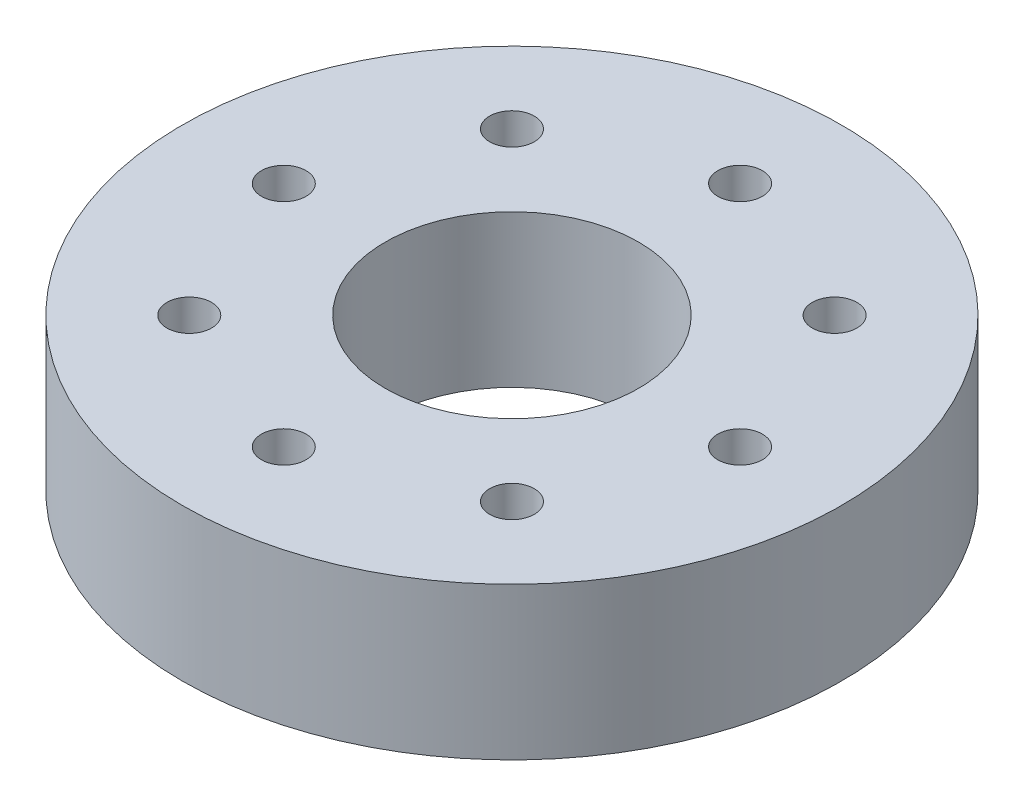
ISO-10303-21;
HEADER;
FILE_DESCRIPTION(('STEP AP214'),'2;1');
FILE_NAME('part.step','',(''),(''),'','','');
FILE_SCHEMA(('AUTOMOTIVE_DESIGN { 1 0 10303 214 1 1 1 1 }'));
ENDSEC;
DATA;
#1=APPLICATION_CONTEXT('core data for automotive mechanical design processes');
#2=APPLICATION_PROTOCOL_DEFINITION('international standard','automotive_design',2000,#1);
#3=PRODUCT_CONTEXT('',#1,'mechanical');
#4=PRODUCT('Part','Part','',(#3));
#5=PRODUCT_RELATED_PRODUCT_CATEGORY('part','',(#4));
#6=PRODUCT_DEFINITION_FORMATION('','',#4);
#7=PRODUCT_DEFINITION_CONTEXT('part definition',#1,'design');
#8=PRODUCT_DEFINITION('design','',#6,#7);
#9=PRODUCT_DEFINITION_SHAPE('','',#8);
#10=(LENGTH_UNIT() NAMED_UNIT(*) SI_UNIT(.MILLI.,.METRE.));
#11=(NAMED_UNIT(*) PLANE_ANGLE_UNIT() SI_UNIT($,.RADIAN.));
#12=(NAMED_UNIT(*) SI_UNIT($,.STERADIAN.) SOLID_ANGLE_UNIT());
#13=UNCERTAINTY_MEASURE_WITH_UNIT(LENGTH_MEASURE(1.E-05),#10,'distance_accuracy_value','');
#14=(GEOMETRIC_REPRESENTATION_CONTEXT(3) GLOBAL_UNCERTAINTY_ASSIGNED_CONTEXT((#13)) GLOBAL_UNIT_ASSIGNED_CONTEXT((#10,
#11,#12)) REPRESENTATION_CONTEXT('',''));
#15=CARTESIAN_POINT('',(0.,0.,0.));
#16=DIRECTION('',(0.,0.,1.));
#17=DIRECTION('',(1.,0.,0.));
#18=AXIS2_PLACEMENT_3D('',#15,#16,#17);
#19=CARTESIAN_POINT('',(0.,15.,0.));
#20=DIRECTION('',(0.,-1.,0.));
#21=DIRECTION('',(0.,0.,-1.));
#22=AXIS2_PLACEMENT_3D('',#19,#20,#21);
#23=CYLINDRICAL_SURFACE('',#22,32.5);
#24=CARTESIAN_POINT('',(0.,15.,0.));
#25=DIRECTION('',(0.,1.,0.));
#26=DIRECTION('',(0.,0.,1.));
#27=AXIS2_PLACEMENT_3D('',#24,#25,#26);
#28=CIRCLE('',#27,32.5);
#29=CARTESIAN_POINT('',(0.,15.,32.5));
#30=VERTEX_POINT('',#29);
#31=EDGE_CURVE('E10',#30,#30,#28,.T.);
#32=ORIENTED_EDGE('',*,*,#31,.F.);
#33=EDGE_LOOP('',(#32));
#34=FACE_BOUND('',#33,.T.);
#35=CARTESIAN_POINT('',(0.,0.,0.));
#36=DIRECTION('',(0.,1.,0.));
#37=DIRECTION('',(0.,0.,1.));
#38=AXIS2_PLACEMENT_3D('',#35,#36,#37);
#39=CIRCLE('',#38,32.5);
#40=CARTESIAN_POINT('',(0.,0.,32.5));
#41=VERTEX_POINT('',#40);
#42=EDGE_CURVE('E40',#41,#41,#39,.T.);
#43=ORIENTED_EDGE('',*,*,#42,.T.);
#44=EDGE_LOOP('',(#43));
#45=FACE_BOUND('',#44,.T.);
#46=ADVANCED_FACE('F37',(#34,#45),#23,.T.);
#47=CARTESIAN_POINT('',(0.,15.,0.));
#48=DIRECTION('',(0.,1.,0.));
#49=DIRECTION('',(0.,0.,1.));
#50=AXIS2_PLACEMENT_3D('',#47,#48,#49);
#51=PLANE('',#50);
#52=CARTESIAN_POINT('',(0.,15.,0.));
#53=DIRECTION('',(0.,1.,0.));
#54=DIRECTION('',(0.,0.,1.));
#55=AXIS2_PLACEMENT_3D('',#52,#53,#54);
#56=CIRCLE('',#55,12.5);
#57=CARTESIAN_POINT('',(0.,15.,12.5));
#58=VERTEX_POINT('',#57);
#59=EDGE_CURVE('E115',#58,#58,#56,.T.);
#60=ORIENTED_EDGE('',*,*,#59,.F.);
#61=EDGE_LOOP('',(#60));
#62=FACE_BOUND('',#61,.T.);
#63=CARTESIAN_POINT('',(0.,15.,-22.5));
#64=DIRECTION('',(0.,1.,0.));
#65=DIRECTION('',(0.,0.,1.));
#66=AXIS2_PLACEMENT_3D('',#63,#64,#65);
#67=CIRCLE('',#66,2.2);
#68=CARTESIAN_POINT('',(0.,15.,-20.3));
#69=VERTEX_POINT('',#68);
#70=EDGE_CURVE('E108',#69,#69,#67,.T.);
#71=ORIENTED_EDGE('',*,*,#70,.F.);
#72=EDGE_LOOP('',(#71));
#73=FACE_BOUND('',#72,.T.);
#74=CARTESIAN_POINT('',(15.9099025766973,15.,-15.9099025766973));
#75=DIRECTION('',(0.,1.,0.));
#76=DIRECTION('',(0.,0.,1.));
#77=AXIS2_PLACEMENT_3D('',#74,#75,#76);
#78=CIRCLE('',#77,2.2);
#79=CARTESIAN_POINT('',(15.9099025766973,15.,-13.7099025766973));
#80=VERTEX_POINT('',#79);
#81=EDGE_CURVE('E100',#80,#80,#78,.T.);
#82=ORIENTED_EDGE('',*,*,#81,.F.);
#83=EDGE_LOOP('',(#82));
#84=FACE_BOUND('',#83,.T.);
#85=CARTESIAN_POINT('',(22.5,15.,0.));
#86=DIRECTION('',(0.,1.,0.));
#87=DIRECTION('',(0.,0.,1.));
#88=AXIS2_PLACEMENT_3D('',#85,#86,#87);
#89=CIRCLE('',#88,2.2);
#90=CARTESIAN_POINT('',(22.5,15.,2.20000000000008));
#91=VERTEX_POINT('',#90);
#92=EDGE_CURVE('E92',#91,#91,#89,.T.);
#93=ORIENTED_EDGE('',*,*,#92,.F.);
#94=EDGE_LOOP('',(#93));
#95=FACE_BOUND('',#94,.T.);
#96=CARTESIAN_POINT('',(15.9099025766972,15.,15.9099025766974));
#97=DIRECTION('',(0.,1.,0.));
#98=DIRECTION('',(0.,0.,1.));
#99=AXIS2_PLACEMENT_3D('',#96,#97,#98);
#100=CIRCLE('',#99,2.2);
#101=CARTESIAN_POINT('',(15.9099025766972,15.,18.1099025766974));
#102=VERTEX_POINT('',#101);
#103=EDGE_CURVE('E84',#102,#102,#100,.T.);
#104=ORIENTED_EDGE('',*,*,#103,.F.);
#105=EDGE_LOOP('',(#104));
#106=FACE_BOUND('',#105,.T.);
#107=CARTESIAN_POINT('',(-1.57116660247941E-13,15.,22.5));
#108=DIRECTION('',(0.,1.,0.));
#109=DIRECTION('',(0.,0.,1.));
#110=AXIS2_PLACEMENT_3D('',#107,#108,#109);
#111=CIRCLE('',#110,2.2);
#112=CARTESIAN_POINT('',(-1.57116660247941E-13,15.,24.7));
#113=VERTEX_POINT('',#112);
#114=EDGE_CURVE('E76',#113,#113,#111,.T.);
#115=ORIENTED_EDGE('',*,*,#114,.F.);
#116=EDGE_LOOP('',(#115));
#117=FACE_BOUND('',#116,.T.);
#118=CARTESIAN_POINT('',(-15.9099025766975,15.,15.9099025766972));
#119=DIRECTION('',(0.,1.,0.));
#120=DIRECTION('',(0.,0.,1.));
#121=AXIS2_PLACEMENT_3D('',#118,#119,#120);
#122=CIRCLE('',#121,2.2);
#123=CARTESIAN_POINT('',(-15.9099025766975,15.,18.1099025766972));
#124=VERTEX_POINT('',#123);
#125=EDGE_CURVE('E68',#124,#124,#122,.T.);
#126=ORIENTED_EDGE('',*,*,#125,.F.);
#127=EDGE_LOOP('',(#126));
#128=FACE_BOUND('',#127,.T.);
#129=CARTESIAN_POINT('',(-22.5,15.,-2.35674990371912E-13));
#130=DIRECTION('',(0.,1.,0.));
#131=DIRECTION('',(0.,0.,1.));
#132=AXIS2_PLACEMENT_3D('',#129,#130,#131);
#133=CIRCLE('',#132,2.2);
#134=CARTESIAN_POINT('',(-22.5,15.,2.19999999999977));
#135=VERTEX_POINT('',#134);
#136=EDGE_CURVE('E60',#135,#135,#133,.T.);
#137=ORIENTED_EDGE('',*,*,#136,.F.);
#138=EDGE_LOOP('',(#137));
#139=FACE_BOUND('',#138,.T.);
#140=CARTESIAN_POINT('',(-15.9099025766971,15.,-15.9099025766975));
#141=DIRECTION('',(0.,1.,0.));
#142=DIRECTION('',(0.,0.,1.));
#143=AXIS2_PLACEMENT_3D('',#140,#141,#142);
#144=CIRCLE('',#143,2.2);
#145=CARTESIAN_POINT('',(-15.9099025766971,15.,-13.7099025766975));
#146=VERTEX_POINT('',#145);
#147=EDGE_CURVE('E51',#146,#146,#144,.T.);
#148=ORIENTED_EDGE('',*,*,#147,.F.);
#149=EDGE_LOOP('',(#148));
#150=FACE_BOUND('',#149,.T.);
#151=ORIENTED_EDGE('',*,*,#31,.T.);
#152=EDGE_LOOP('',(#151));
#153=FACE_BOUND('',#152,.T.);
#154=ADVANCED_FACE('F133',(#62,#73,#84,#95,#106,#117,#128,#139,#150,#153),#51,.T.);
#155=CARTESIAN_POINT('',(0.,0.,0.));
#156=DIRECTION('',(0.,1.,0.));
#157=DIRECTION('',(0.,0.,1.));
#158=AXIS2_PLACEMENT_3D('',#155,#156,#157);
#159=PLANE('',#158);
#160=CARTESIAN_POINT('',(0.,0.,0.));
#161=DIRECTION('',(0.,1.,0.));
#162=DIRECTION('',(0.,0.,1.));
#163=AXIS2_PLACEMENT_3D('',#160,#161,#162);
#164=CIRCLE('',#163,12.5);
#165=CARTESIAN_POINT('',(0.,0.,12.5));
#166=VERTEX_POINT('',#165);
#167=EDGE_CURVE('E56',#166,#166,#164,.T.);
#168=ORIENTED_EDGE('',*,*,#167,.T.);
#169=EDGE_LOOP('',(#168));
#170=FACE_BOUND('',#169,.T.);
#171=CARTESIAN_POINT('',(0.,0.,-22.5));
#172=DIRECTION('',(0.,1.,0.));
#173=DIRECTION('',(0.,0.,1.));
#174=AXIS2_PLACEMENT_3D('',#171,#172,#173);
#175=CIRCLE('',#174,2.2);
#176=CARTESIAN_POINT('',(0.,0.,-20.3));
#177=VERTEX_POINT('',#176);
#178=EDGE_CURVE('E49',#177,#177,#175,.T.);
#179=ORIENTED_EDGE('',*,*,#178,.T.);
#180=EDGE_LOOP('',(#179));
#181=FACE_BOUND('',#180,.T.);
#182=CARTESIAN_POINT('',(15.9099025766973,0.,-15.9099025766973));
#183=DIRECTION('',(0.,1.,0.));
#184=DIRECTION('',(0.,0.,1.));
#185=AXIS2_PLACEMENT_3D('',#182,#183,#184);
#186=CIRCLE('',#185,2.2);
#187=CARTESIAN_POINT('',(15.9099025766973,0.,-13.7099025766973));
#188=VERTEX_POINT('',#187);
#189=EDGE_CURVE('E104',#188,#188,#186,.T.);
#190=ORIENTED_EDGE('',*,*,#189,.T.);
#191=EDGE_LOOP('',(#190));
#192=FACE_BOUND('',#191,.T.);
#193=CARTESIAN_POINT('',(22.5,0.,0.));
#194=DIRECTION('',(0.,1.,0.));
#195=DIRECTION('',(0.,0.,1.));
#196=AXIS2_PLACEMENT_3D('',#193,#194,#195);
#197=CIRCLE('',#196,2.2);
#198=CARTESIAN_POINT('',(22.5,0.,2.20000000000008));
#199=VERTEX_POINT('',#198);
#200=EDGE_CURVE('E96',#199,#199,#197,.T.);
#201=ORIENTED_EDGE('',*,*,#200,.T.);
#202=EDGE_LOOP('',(#201));
#203=FACE_BOUND('',#202,.T.);
#204=CARTESIAN_POINT('',(15.9099025766972,0.,15.9099025766974));
#205=DIRECTION('',(0.,1.,0.));
#206=DIRECTION('',(0.,0.,1.));
#207=AXIS2_PLACEMENT_3D('',#204,#205,#206);
#208=CIRCLE('',#207,2.2);
#209=CARTESIAN_POINT('',(15.9099025766972,0.,18.1099025766974));
#210=VERTEX_POINT('',#209);
#211=EDGE_CURVE('E88',#210,#210,#208,.T.);
#212=ORIENTED_EDGE('',*,*,#211,.T.);
#213=EDGE_LOOP('',(#212));
#214=FACE_BOUND('',#213,.T.);
#215=CARTESIAN_POINT('',(-1.57116660247941E-13,0.,22.5));
#216=DIRECTION('',(0.,1.,0.));
#217=DIRECTION('',(0.,0.,1.));
#218=AXIS2_PLACEMENT_3D('',#215,#216,#217);
#219=CIRCLE('',#218,2.2);
#220=CARTESIAN_POINT('',(-1.57116660247941E-13,0.,24.7));
#221=VERTEX_POINT('',#220);
#222=EDGE_CURVE('E80',#221,#221,#219,.T.);
#223=ORIENTED_EDGE('',*,*,#222,.T.);
#224=EDGE_LOOP('',(#223));
#225=FACE_BOUND('',#224,.T.);
#226=CARTESIAN_POINT('',(-15.9099025766975,0.,15.9099025766972));
#227=DIRECTION('',(0.,1.,0.));
#228=DIRECTION('',(0.,0.,1.));
#229=AXIS2_PLACEMENT_3D('',#226,#227,#228);
#230=CIRCLE('',#229,2.2);
#231=CARTESIAN_POINT('',(-15.9099025766975,0.,18.1099025766972));
#232=VERTEX_POINT('',#231);
#233=EDGE_CURVE('E72',#232,#232,#230,.T.);
#234=ORIENTED_EDGE('',*,*,#233,.T.);
#235=EDGE_LOOP('',(#234));
#236=FACE_BOUND('',#235,.T.);
#237=CARTESIAN_POINT('',(-22.5,0.,-2.35674990371912E-13));
#238=DIRECTION('',(0.,1.,0.));
#239=DIRECTION('',(0.,0.,1.));
#240=AXIS2_PLACEMENT_3D('',#237,#238,#239);
#241=CIRCLE('',#240,2.2);
#242=CARTESIAN_POINT('',(-22.5,0.,2.19999999999977));
#243=VERTEX_POINT('',#242);
#244=EDGE_CURVE('E64',#243,#243,#241,.T.);
#245=ORIENTED_EDGE('',*,*,#244,.T.);
#246=EDGE_LOOP('',(#245));
#247=FACE_BOUND('',#246,.T.);
#248=CARTESIAN_POINT('',(-15.9099025766971,0.,-15.9099025766975));
#249=DIRECTION('',(0.,1.,0.));
#250=DIRECTION('',(0.,0.,1.));
#251=AXIS2_PLACEMENT_3D('',#248,#249,#250);
#252=CIRCLE('',#251,2.2);
#253=CARTESIAN_POINT('',(-15.9099025766971,0.,-13.7099025766975));
#254=VERTEX_POINT('',#253);
#255=EDGE_CURVE('E55',#254,#254,#252,.T.);
#256=ORIENTED_EDGE('',*,*,#255,.T.);
#257=EDGE_LOOP('',(#256));
#258=FACE_BOUND('',#257,.T.);
#259=ORIENTED_EDGE('',*,*,#42,.F.);
#260=EDGE_LOOP('',(#259));
#261=FACE_BOUND('',#260,.T.);
#262=ADVANCED_FACE('F123',(#170,#181,#192,#203,#214,#225,#236,#247,#258,#261),#159,.F.);
#263=CARTESIAN_POINT('',(-15.9099025766971,0.,-15.9099025766975));
#264=DIRECTION('',(0.,1.,0.));
#265=DIRECTION('',(0.,0.,1.));
#266=AXIS2_PLACEMENT_3D('',#263,#264,#265);
#267=CYLINDRICAL_SURFACE('',#266,2.2);
#268=ORIENTED_EDGE('',*,*,#255,.F.);
#269=EDGE_LOOP('',(#268));
#270=FACE_BOUND('',#269,.T.);
#271=ORIENTED_EDGE('',*,*,#147,.T.);
#272=EDGE_LOOP('',(#271));
#273=FACE_BOUND('',#272,.T.);
#274=ADVANCED_FACE('F153',(#270,#273),#267,.F.);
#275=CARTESIAN_POINT('',(-22.5,0.,-2.35674990371912E-13));
#276=DIRECTION('',(0.,1.,0.));
#277=DIRECTION('',(0.,0.,1.));
#278=AXIS2_PLACEMENT_3D('',#275,#276,#277);
#279=CYLINDRICAL_SURFACE('',#278,2.2);
#280=ORIENTED_EDGE('',*,*,#244,.F.);
#281=EDGE_LOOP('',(#280));
#282=FACE_BOUND('',#281,.T.);
#283=ORIENTED_EDGE('',*,*,#136,.T.);
#284=EDGE_LOOP('',(#283));
#285=FACE_BOUND('',#284,.T.);
#286=ADVANCED_FACE('F155',(#282,#285),#279,.F.);
#287=CARTESIAN_POINT('',(-15.9099025766975,0.,15.9099025766972));
#288=DIRECTION('',(0.,1.,0.));
#289=DIRECTION('',(0.,0.,1.));
#290=AXIS2_PLACEMENT_3D('',#287,#288,#289);
#291=CYLINDRICAL_SURFACE('',#290,2.2);
#292=ORIENTED_EDGE('',*,*,#233,.F.);
#293=EDGE_LOOP('',(#292));
#294=FACE_BOUND('',#293,.T.);
#295=ORIENTED_EDGE('',*,*,#125,.T.);
#296=EDGE_LOOP('',(#295));
#297=FACE_BOUND('',#296,.T.);
#298=ADVANCED_FACE('F162',(#294,#297),#291,.F.);
#299=CARTESIAN_POINT('',(-1.57116660247941E-13,0.,22.5));
#300=DIRECTION('',(0.,1.,0.));
#301=DIRECTION('',(0.,0.,1.));
#302=AXIS2_PLACEMENT_3D('',#299,#300,#301);
#303=CYLINDRICAL_SURFACE('',#302,2.2);
#304=ORIENTED_EDGE('',*,*,#222,.F.);
#305=EDGE_LOOP('',(#304));
#306=FACE_BOUND('',#305,.T.);
#307=ORIENTED_EDGE('',*,*,#114,.T.);
#308=EDGE_LOOP('',(#307));
#309=FACE_BOUND('',#308,.T.);
#310=ADVANCED_FACE('F220',(#306,#309),#303,.F.);
#311=CARTESIAN_POINT('',(15.9099025766972,0.,15.9099025766974));
#312=DIRECTION('',(0.,1.,0.));
#313=DIRECTION('',(0.,0.,1.));
#314=AXIS2_PLACEMENT_3D('',#311,#312,#313);
#315=CYLINDRICAL_SURFACE('',#314,2.2);
#316=ORIENTED_EDGE('',*,*,#211,.F.);
#317=EDGE_LOOP('',(#316));
#318=FACE_BOUND('',#317,.T.);
#319=ORIENTED_EDGE('',*,*,#103,.T.);
#320=EDGE_LOOP('',(#319));
#321=FACE_BOUND('',#320,.T.);
#322=ADVANCED_FACE('F212',(#318,#321),#315,.F.);
#323=CARTESIAN_POINT('',(22.5,0.,0.));
#324=DIRECTION('',(0.,1.,0.));
#325=DIRECTION('',(0.,0.,1.));
#326=AXIS2_PLACEMENT_3D('',#323,#324,#325);
#327=CYLINDRICAL_SURFACE('',#326,2.2);
#328=ORIENTED_EDGE('',*,*,#200,.F.);
#329=EDGE_LOOP('',(#328));
#330=FACE_BOUND('',#329,.T.);
#331=ORIENTED_EDGE('',*,*,#92,.T.);
#332=EDGE_LOOP('',(#331));
#333=FACE_BOUND('',#332,.T.);
#334=ADVANCED_FACE('F204',(#330,#333),#327,.F.);
#335=CARTESIAN_POINT('',(15.9099025766973,0.,-15.9099025766973));
#336=DIRECTION('',(0.,1.,0.));
#337=DIRECTION('',(0.,0.,1.));
#338=AXIS2_PLACEMENT_3D('',#335,#336,#337);
#339=CYLINDRICAL_SURFACE('',#338,2.2);
#340=ORIENTED_EDGE('',*,*,#189,.F.);
#341=EDGE_LOOP('',(#340));
#342=FACE_BOUND('',#341,.T.);
#343=ORIENTED_EDGE('',*,*,#81,.T.);
#344=EDGE_LOOP('',(#343));
#345=FACE_BOUND('',#344,.T.);
#346=ADVANCED_FACE('F197',(#342,#345),#339,.F.);
#347=CARTESIAN_POINT('',(0.,0.,-22.5));
#348=DIRECTION('',(0.,1.,0.));
#349=DIRECTION('',(0.,0.,1.));
#350=AXIS2_PLACEMENT_3D('',#347,#348,#349);
#351=CYLINDRICAL_SURFACE('',#350,2.2);
#352=ORIENTED_EDGE('',*,*,#178,.F.);
#353=EDGE_LOOP('',(#352));
#354=FACE_BOUND('',#353,.T.);
#355=ORIENTED_EDGE('',*,*,#70,.T.);
#356=EDGE_LOOP('',(#355));
#357=FACE_BOUND('',#356,.T.);
#358=ADVANCED_FACE('F129',(#354,#357),#351,.F.);
#359=CARTESIAN_POINT('',(0.,0.,0.));
#360=DIRECTION('',(0.,1.,0.));
#361=DIRECTION('',(0.,0.,1.));
#362=AXIS2_PLACEMENT_3D('',#359,#360,#361);
#363=CYLINDRICAL_SURFACE('',#362,12.5);
#364=ORIENTED_EDGE('',*,*,#167,.F.);
#365=EDGE_LOOP('',(#364));
#366=FACE_BOUND('',#365,.T.);
#367=ORIENTED_EDGE('',*,*,#59,.T.);
#368=EDGE_LOOP('',(#367));
#369=FACE_BOUND('',#368,.T.);
#370=ADVANCED_FACE('F126',(#366,#369),#363,.F.);
#371=CLOSED_SHELL('',(#46,#154,#262,#274,#286,#298,#310,#322,#334,#346,#358,#370));
#372=MANIFOLD_SOLID_BREP('B2',#371);
#373=ADVANCED_BREP_SHAPE_REPRESENTATION('',(#18,#372),#14);
#374=SHAPE_DEFINITION_REPRESENTATION(#9,#373);
ENDSEC;
END-ISO-10303-21;
